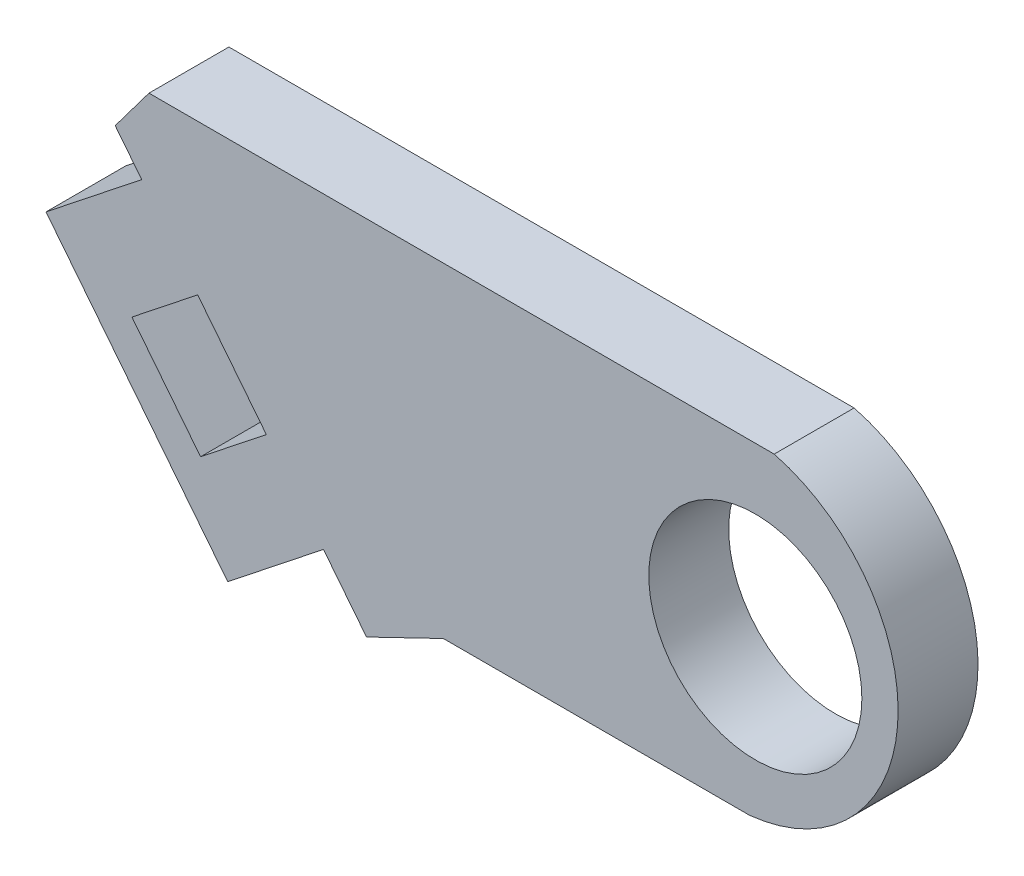
ISO-10303-21;
HEADER;
FILE_DESCRIPTION(('STEP AP214'),'2;1');
FILE_NAME('part.step','',(''),(''),'','','');
FILE_SCHEMA(('AUTOMOTIVE_DESIGN { 1 0 10303 214 1 1 1 1 }'));
ENDSEC;
DATA;
#1=APPLICATION_CONTEXT('core data for automotive mechanical design processes');
#2=APPLICATION_PROTOCOL_DEFINITION('international standard','automotive_design',2000,#1);
#3=PRODUCT_CONTEXT('',#1,'mechanical');
#4=PRODUCT('Part','Part','',(#3));
#5=PRODUCT_RELATED_PRODUCT_CATEGORY('part','',(#4));
#6=PRODUCT_DEFINITION_FORMATION('','',#4);
#7=PRODUCT_DEFINITION_CONTEXT('part definition',#1,'design');
#8=PRODUCT_DEFINITION('design','',#6,#7);
#9=PRODUCT_DEFINITION_SHAPE('','',#8);
#10=(LENGTH_UNIT() NAMED_UNIT(*) SI_UNIT(.MILLI.,.METRE.));
#11=(NAMED_UNIT(*) PLANE_ANGLE_UNIT() SI_UNIT($,.RADIAN.));
#12=(NAMED_UNIT(*) SI_UNIT($,.STERADIAN.) SOLID_ANGLE_UNIT());
#13=UNCERTAINTY_MEASURE_WITH_UNIT(LENGTH_MEASURE(1.E-05),#10,'distance_accuracy_value','');
#14=(GEOMETRIC_REPRESENTATION_CONTEXT(3) GLOBAL_UNCERTAINTY_ASSIGNED_CONTEXT((#13)) GLOBAL_UNIT_ASSIGNED_CONTEXT((#10,
#11,#12)) REPRESENTATION_CONTEXT('',''));
#15=CARTESIAN_POINT('',(0.,0.,0.));
#16=DIRECTION('',(0.,0.,1.));
#17=DIRECTION('',(1.,0.,0.));
#18=AXIS2_PLACEMENT_3D('',#15,#16,#17);
#19=CARTESIAN_POINT('',(3.41129841970065,-4.30599411770939,-3.));
#20=DIRECTION('',(0.62096994988635,-0.78383437111302,0.));
#21=DIRECTION('',(0.78383437111302,0.62096994988635,0.));
#22=AXIS2_PLACEMENT_3D('',#19,#20,#21);
#23=PLANE('',#22);
#24=DIRECTION('',(0.78383437111302,0.62096994988635,0.));
#25=VECTOR('',#24,1.);
#26=CARTESIAN_POINT('',(3.41129841970065,-4.30599411770939,0.));
#27=LINE('',#26,#25);
#28=CARTESIAN_POINT('',(3.41129841970065,-4.30599411770939,0.));
#29=VERTEX_POINT('',#28);
#30=CARTESIAN_POINT('',(7.00517901125505,-1.45884689747952,0.));
#31=VERTEX_POINT('',#30);
#32=EDGE_CURVE('E170',#29,#31,#27,.T.);
#33=ORIENTED_EDGE('',*,*,#32,.F.);
#34=DIRECTION('',(0.,0.,1.));
#35=VECTOR('',#34,1.);
#36=CARTESIAN_POINT('',(3.41129841970065,-4.30599411770939,-3.));
#37=LINE('',#36,#35);
#38=CARTESIAN_POINT('',(3.41129841970065,-4.30599411770939,-3.));
#39=VERTEX_POINT('',#38);
#40=EDGE_CURVE('E11',#39,#29,#37,.T.);
#41=ORIENTED_EDGE('',*,*,#40,.F.);
#42=DIRECTION('',(0.78383437111302,0.62096994988635,0.));
#43=VECTOR('',#42,1.);
#44=CARTESIAN_POINT('',(3.41129841970065,-4.30599411770939,-3.));
#45=LINE('',#44,#43);
#46=CARTESIAN_POINT('',(7.00517901125505,-1.45884689747952,-3.));
#47=VERTEX_POINT('',#46);
#48=EDGE_CURVE('E174',#39,#47,#45,.T.);
#49=ORIENTED_EDGE('',*,*,#48,.T.);
#50=DIRECTION('',(0.,0.,1.));
#51=VECTOR('',#50,1.);
#52=CARTESIAN_POINT('',(7.00517901125505,-1.45884689747952,-3.));
#53=LINE('',#52,#51);
#54=EDGE_CURVE('E35',#47,#31,#53,.T.);
#55=ORIENTED_EDGE('',*,*,#54,.T.);
#56=EDGE_LOOP('',(#33,#41,#49,#55));
#57=FACE_BOUND('',#56,.T.);
#58=ADVANCED_FACE('F32',(#57),#23,.T.);
#59=CARTESIAN_POINT('',(-3.41129841970065,4.30599411770939,-3.));
#60=DIRECTION('',(-0.783834371113022,-0.620969949886348,0.));
#61=DIRECTION('',(0.620969949886348,-0.783834371113022,0.));
#62=AXIS2_PLACEMENT_3D('',#59,#60,#61);
#63=PLANE('',#62);
#64=DIRECTION('',(0.620969949886347,-0.783834371113022,0.));
#65=VECTOR('',#64,1.);
#66=CARTESIAN_POINT('',(-3.41129841970065,4.30599411770939,0.));
#67=LINE('',#66,#65);
#68=CARTESIAN_POINT('',(-3.41129841970065,4.30599411770939,0.));
#69=VERTEX_POINT('',#68);
#70=EDGE_CURVE('E178',#69,#29,#67,.T.);
#71=ORIENTED_EDGE('',*,*,#70,.F.);
#72=DIRECTION('',(0.,0.,1.));
#73=VECTOR('',#72,1.);
#74=CARTESIAN_POINT('',(-3.41129841970065,4.30599411770939,-3.));
#75=LINE('',#74,#73);
#76=CARTESIAN_POINT('',(-3.41129841970065,4.30599411770939,-3.));
#77=VERTEX_POINT('',#76);
#78=EDGE_CURVE('E40',#77,#69,#75,.T.);
#79=ORIENTED_EDGE('',*,*,#78,.F.);
#80=DIRECTION('',(0.620969949886347,-0.783834371113022,0.));
#81=VECTOR('',#80,1.);
#82=CARTESIAN_POINT('',(-3.41129841970065,4.30599411770939,-3.));
#83=LINE('',#82,#81);
#84=EDGE_CURVE('E202',#77,#39,#83,.T.);
#85=ORIENTED_EDGE('',*,*,#84,.T.);
#86=ORIENTED_EDGE('',*,*,#40,.T.);
#87=EDGE_LOOP('',(#71,#79,#85,#86));
#88=FACE_BOUND('',#87,.T.);
#89=ADVANCED_FACE('F259',(#88),#63,.T.);
#90=CARTESIAN_POINT('',(-3.41129841970065,4.30599411770939,-3.));
#91=DIRECTION('',(-0.620969949886348,0.783834371113022,0.));
#92=DIRECTION('',(-0.783834371113022,-0.620969949886348,0.));
#93=AXIS2_PLACEMENT_3D('',#90,#91,#92);
#94=PLANE('',#93);
#95=DIRECTION('',(-0.783834371113022,-0.620969949886348,0.));
#96=VECTOR('',#95,1.);
#97=CARTESIAN_POINT('',(-3.41129841970065,4.30599411770939,0.));
#98=LINE('',#97,#96);
#99=CARTESIAN_POINT('',(0.182582171852518,7.15314133793826,0.));
#100=VERTEX_POINT('',#99);
#101=EDGE_CURVE('E228',#100,#69,#98,.T.);
#102=ORIENTED_EDGE('',*,*,#101,.F.);
#103=DIRECTION('',(0.,0.,1.));
#104=VECTOR('',#103,1.);
#105=CARTESIAN_POINT('',(0.182582171852518,7.15314133793826,-3.));
#106=LINE('',#105,#104);
#107=CARTESIAN_POINT('',(0.182582171852518,7.15314133793826,-3.));
#108=VERTEX_POINT('',#107);
#109=EDGE_CURVE('E234',#108,#100,#106,.T.);
#110=ORIENTED_EDGE('',*,*,#109,.F.);
#111=DIRECTION('',(-0.783834371113022,-0.620969949886348,0.));
#112=VECTOR('',#111,1.);
#113=CARTESIAN_POINT('',(-3.41129841970065,4.30599411770939,-3.));
#114=LINE('',#113,#112);
#115=EDGE_CURVE('E199',#108,#77,#114,.T.);
#116=ORIENTED_EDGE('',*,*,#115,.T.);
#117=ORIENTED_EDGE('',*,*,#78,.T.);
#118=EDGE_LOOP('',(#102,#110,#116,#117));
#119=FACE_BOUND('',#118,.T.);
#120=ADVANCED_FACE('F286',(#119),#94,.T.);
#121=CARTESIAN_POINT('',(-0.813143142790196,8.41001975201794,-3.));
#122=DIRECTION('',(-0.783834371113024,-0.620969949886345,0.));
#123=DIRECTION('',(0.620969949886345,-0.783834371113024,0.));
#124=AXIS2_PLACEMENT_3D('',#121,#122,#123);
#125=PLANE('',#124);
#126=DIRECTION('',(0.620969949886345,-0.783834371113024,0.));
#127=VECTOR('',#126,1.);
#128=CARTESIAN_POINT('',(-0.813143142790196,8.41001975201794,0.));
#129=LINE('',#128,#127);
#130=CARTESIAN_POINT('',(-0.813143142790196,8.41001975201794,0.));
#131=VERTEX_POINT('',#130);
#132=EDGE_CURVE('E225',#131,#100,#129,.T.);
#133=ORIENTED_EDGE('',*,*,#132,.F.);
#134=DIRECTION('',(0.,0.,1.));
#135=VECTOR('',#134,1.);
#136=CARTESIAN_POINT('',(-0.813143142790196,8.41001975201794,-3.));
#137=LINE('',#136,#135);
#138=CARTESIAN_POINT('',(-0.813143142790196,8.41001975201794,-3.));
#139=VERTEX_POINT('',#138);
#140=EDGE_CURVE('E236',#139,#131,#137,.T.);
#141=ORIENTED_EDGE('',*,*,#140,.F.);
#142=DIRECTION('',(0.620969949886345,-0.783834371113024,0.));
#143=VECTOR('',#142,1.);
#144=CARTESIAN_POINT('',(-0.813143142790196,8.41001975201794,-3.));
#145=LINE('',#144,#143);
#146=EDGE_CURVE('E196',#139,#108,#145,.T.);
#147=ORIENTED_EDGE('',*,*,#146,.T.);
#148=ORIENTED_EDGE('',*,*,#109,.T.);
#149=EDGE_LOOP('',(#133,#141,#147,#148));
#150=FACE_BOUND('',#149,.T.);
#151=ADVANCED_FACE('F284',(#150),#125,.T.);
#152=CARTESIAN_POINT('',(-0.813143142790196,8.41001975201794,-3.));
#153=DIRECTION('',(-0.799998928148521,0.600001429132646,0.));
#154=DIRECTION('',(-0.600001429132646,-0.799998928148521,0.));
#155=AXIS2_PLACEMENT_3D('',#152,#153,#154);
#156=PLANE('',#155);
#157=DIRECTION('',(-0.600001429132646,-0.799998928148521,0.));
#158=VECTOR('',#157,1.);
#159=CARTESIAN_POINT('',(-0.813143142790196,8.41001975201794,0.));
#160=LINE('',#159,#158);
#161=CARTESIAN_POINT('',(0.454659876967119,10.1004174871958,0.));
#162=VERTEX_POINT('',#161);
#163=EDGE_CURVE('E222',#162,#131,#160,.T.);
#164=ORIENTED_EDGE('',*,*,#163,.F.);
#165=DIRECTION('',(0.,0.,1.));
#166=VECTOR('',#165,1.);
#167=CARTESIAN_POINT('',(0.454659876967119,10.1004174871958,-3.));
#168=LINE('',#167,#166);
#169=CARTESIAN_POINT('',(0.454659876967119,10.1004174871958,-3.));
#170=VERTEX_POINT('',#169);
#171=EDGE_CURVE('E238',#170,#162,#168,.T.);
#172=ORIENTED_EDGE('',*,*,#171,.F.);
#173=DIRECTION('',(-0.600001429132646,-0.799998928148521,0.));
#174=VECTOR('',#173,1.);
#175=CARTESIAN_POINT('',(-0.813143142790196,8.41001975201794,-3.));
#176=LINE('',#175,#174);
#177=EDGE_CURVE('E193',#170,#139,#176,.T.);
#178=ORIENTED_EDGE('',*,*,#177,.T.);
#179=ORIENTED_EDGE('',*,*,#140,.T.);
#180=EDGE_LOOP('',(#164,#172,#178,#179));
#181=FACE_BOUND('',#180,.T.);
#182=ADVANCED_FACE('F280',(#181),#156,.T.);
#183=CARTESIAN_POINT('',(0.454659876967119,10.1004174871958,-3.));
#184=DIRECTION('',(0.,1.,0.));
#185=DIRECTION('',(-1.,0.,0.));
#186=AXIS2_PLACEMENT_3D('',#183,#184,#185);
#187=PLANE('',#186);
#188=DIRECTION('',(-1.,0.,0.));
#189=VECTOR('',#188,1.);
#190=CARTESIAN_POINT('',(0.454659876967119,10.1004174871958,0.));
#191=LINE('',#190,#189);
#192=CARTESIAN_POINT('',(23.9256598769671,10.1004174871962,0.));
#193=VERTEX_POINT('',#192);
#194=EDGE_CURVE('E219',#193,#162,#191,.T.);
#195=ORIENTED_EDGE('',*,*,#194,.F.);
#196=DIRECTION('',(0.,0.,1.));
#197=VECTOR('',#196,1.);
#198=CARTESIAN_POINT('',(23.9256598769671,10.1004174871962,-3.));
#199=LINE('',#198,#197);
#200=CARTESIAN_POINT('',(23.9256598769671,10.1004174871962,-3.));
#201=VERTEX_POINT('',#200);
#202=EDGE_CURVE('E240',#201,#193,#199,.T.);
#203=ORIENTED_EDGE('',*,*,#202,.F.);
#204=DIRECTION('',(-1.,0.,0.));
#205=VECTOR('',#204,1.);
#206=CARTESIAN_POINT('',(0.454659876967119,10.1004174871958,-3.));
#207=LINE('',#206,#205);
#208=EDGE_CURVE('E190',#201,#170,#207,.T.);
#209=ORIENTED_EDGE('',*,*,#208,.T.);
#210=ORIENTED_EDGE('',*,*,#171,.T.);
#211=EDGE_LOOP('',(#195,#203,#209,#210));
#212=FACE_BOUND('',#211,.T.);
#213=ADVANCED_FACE('F276',(#212),#187,.T.);
#214=CARTESIAN_POINT('',(22.3574656584487,4.08135054181249,-3.));
#215=DIRECTION('',(0.,0.,1.));
#216=DIRECTION('',(1.,0.,0.));
#217=AXIS2_PLACEMENT_3D('',#214,#215,#216);
#218=CYLINDRICAL_SURFACE('',#217,6.22000000000003);
#219=CARTESIAN_POINT('',(22.3574656584487,4.08135054181249,0.));
#220=DIRECTION('',(0.,0.,1.));
#221=DIRECTION('',(1.,0.,0.));
#222=AXIS2_PLACEMENT_3D('',#219,#220,#221);
#223=CIRCLE('',#222,6.22000000000003);
#224=CARTESIAN_POINT('',(23.0003635073065,-2.1053353525848,0.));
#225=VERTEX_POINT('',#224);
#226=EDGE_CURVE('E216',#225,#193,#223,.T.);
#227=ORIENTED_EDGE('',*,*,#226,.F.);
#228=DIRECTION('',(0.,0.,1.));
#229=VECTOR('',#228,1.);
#230=CARTESIAN_POINT('',(23.0003635073065,-2.1053353525848,-3.));
#231=LINE('',#230,#229);
#232=CARTESIAN_POINT('',(23.0003635073065,-2.1053353525848,-3.));
#233=VERTEX_POINT('',#232);
#234=EDGE_CURVE('E242',#233,#225,#231,.T.);
#235=ORIENTED_EDGE('',*,*,#234,.F.);
#236=CARTESIAN_POINT('',(22.3574656584487,4.08135054181249,-3.));
#237=DIRECTION('',(0.,0.,1.));
#238=DIRECTION('',(1.,0.,0.));
#239=AXIS2_PLACEMENT_3D('',#236,#237,#238);
#240=CIRCLE('',#239,6.22000000000003);
#241=EDGE_CURVE('E187',#233,#201,#240,.T.);
#242=ORIENTED_EDGE('',*,*,#241,.T.);
#243=ORIENTED_EDGE('',*,*,#202,.T.);
#244=EDGE_LOOP('',(#227,#235,#242,#243));
#245=FACE_BOUND('',#244,.T.);
#246=ADVANCED_FACE('F272',(#245),#218,.T.);
#247=CARTESIAN_POINT('',(11.5053635090573,-2.10553597818655,-3.));
#248=DIRECTION('',(1.74532929224492E-05,-0.999999999847691,0.));
#249=DIRECTION('',(0.999999999847691,1.74532929224492E-05,0.));
#250=AXIS2_PLACEMENT_3D('',#247,#248,#249);
#251=PLANE('',#250);
#252=DIRECTION('',(0.999999999847691,1.74532929224492E-05,0.));
#253=VECTOR('',#252,1.);
#254=CARTESIAN_POINT('',(11.5053635090573,-2.10553597818655,0.));
#255=LINE('',#254,#253);
#256=CARTESIAN_POINT('',(11.5053635090573,-2.10553597818655,0.));
#257=VERTEX_POINT('',#256);
#258=EDGE_CURVE('E213',#257,#225,#255,.T.);
#259=ORIENTED_EDGE('',*,*,#258,.F.);
#260=DIRECTION('',(0.,0.,1.));
#261=VECTOR('',#260,1.);
#262=CARTESIAN_POINT('',(11.5053635090573,-2.10553597818655,-3.));
#263=LINE('',#262,#261);
#264=CARTESIAN_POINT('',(11.5053635090573,-2.10553597818655,-3.));
#265=VERTEX_POINT('',#264);
#266=EDGE_CURVE('E244',#265,#257,#263,.T.);
#267=ORIENTED_EDGE('',*,*,#266,.F.);
#268=DIRECTION('',(0.999999999847691,1.74532929224492E-05,0.));
#269=VECTOR('',#268,1.);
#270=CARTESIAN_POINT('',(11.5053635090573,-2.10553597818655,-3.));
#271=LINE('',#270,#269);
#272=EDGE_CURVE('E184',#265,#233,#271,.T.);
#273=ORIENTED_EDGE('',*,*,#272,.T.);
#274=ORIENTED_EDGE('',*,*,#234,.T.);
#275=EDGE_LOOP('',(#259,#267,#273,#274));
#276=FACE_BOUND('',#275,.T.);
#277=ADVANCED_FACE('F270',(#276),#251,.T.);
#278=CARTESIAN_POINT('',(8.62125330583921,-3.49877584830702,-3.));
#279=DIRECTION('',(0.434979665975796,-0.90044027574714,0.));
#280=DIRECTION('',(0.90044027574714,0.434979665975796,0.));
#281=AXIS2_PLACEMENT_3D('',#278,#279,#280);
#282=PLANE('',#281);
#283=DIRECTION('',(0.90044027574714,0.434979665975796,0.));
#284=VECTOR('',#283,1.);
#285=CARTESIAN_POINT('',(8.62125330583921,-3.49877584830702,0.));
#286=LINE('',#285,#284);
#287=CARTESIAN_POINT('',(8.62125330583921,-3.49877584830702,0.));
#288=VERTEX_POINT('',#287);
#289=EDGE_CURVE('E210',#288,#257,#286,.T.);
#290=ORIENTED_EDGE('',*,*,#289,.F.);
#291=DIRECTION('',(0.,0.,1.));
#292=VECTOR('',#291,1.);
#293=CARTESIAN_POINT('',(8.62125330583921,-3.49877584830702,-3.));
#294=LINE('',#293,#292);
#295=CARTESIAN_POINT('',(8.62125330583921,-3.49877584830702,-3.));
#296=VERTEX_POINT('',#295);
#297=EDGE_CURVE('E245',#296,#288,#294,.T.);
#298=ORIENTED_EDGE('',*,*,#297,.F.);
#299=DIRECTION('',(0.90044027574714,0.434979665975796,0.));
#300=VECTOR('',#299,1.);
#301=CARTESIAN_POINT('',(8.62125330583921,-3.49877584830702,-3.));
#302=LINE('',#301,#300);
#303=EDGE_CURVE('E181',#296,#265,#302,.T.);
#304=ORIENTED_EDGE('',*,*,#303,.T.);
#305=ORIENTED_EDGE('',*,*,#266,.T.);
#306=EDGE_LOOP('',(#290,#298,#304,#305));
#307=FACE_BOUND('',#306,.T.);
#308=ADVANCED_FACE('F266',(#307),#282,.T.);
#309=CARTESIAN_POINT('',(8.62125330583921,-3.49877584830702,-3.));
#310=DIRECTION('',(-0.783834371112966,-0.620969949886419,0.));
#311=DIRECTION('',(0.620969949886419,-0.783834371112966,0.));
#312=AXIS2_PLACEMENT_3D('',#309,#310,#311);
#313=PLANE('',#312);
#314=DIRECTION('',(0.620969949886418,-0.783834371112966,0.));
#315=VECTOR('',#314,1.);
#316=CARTESIAN_POINT('',(8.62125330583921,-3.49877584830702,0.));
#317=LINE('',#316,#315);
#318=EDGE_CURVE('E207',#31,#288,#317,.T.);
#319=ORIENTED_EDGE('',*,*,#318,.F.);
#320=ORIENTED_EDGE('',*,*,#54,.F.);
#321=DIRECTION('',(0.620969949886418,-0.783834371112966,0.));
#322=VECTOR('',#321,1.);
#323=CARTESIAN_POINT('',(8.62125330583921,-3.49877584830702,-3.));
#324=LINE('',#323,#322);
#325=EDGE_CURVE('E177',#47,#296,#324,.T.);
#326=ORIENTED_EDGE('',*,*,#325,.T.);
#327=ORIENTED_EDGE('',*,*,#297,.T.);
#328=EDGE_LOOP('',(#319,#320,#326,#327));
#329=FACE_BOUND('',#328,.T.);
#330=ADVANCED_FACE('F253',(#329),#313,.T.);
#331=CARTESIAN_POINT('',(22.3574656584487,4.08135054181249,-3.));
#332=DIRECTION('',(0.,0.,1.));
#333=DIRECTION('',(1.,0.,0.));
#334=AXIS2_PLACEMENT_3D('',#331,#332,#333);
#335=PLANE('',#334);
#336=CARTESIAN_POINT('',(23.2173635073057,3.80266464741551,-3.));
#337=DIRECTION('',(0.,0.,1.));
#338=DIRECTION('',(1.,0.,0.));
#339=AXIS2_PLACEMENT_3D('',#336,#337,#338);
#340=CIRCLE('',#339,3.9999999999952);
#341=CARTESIAN_POINT('',(27.2173635073009,3.80266464741551,-3.));
#342=VERTEX_POINT('',#341);
#343=EDGE_CURVE('E164',#342,#342,#340,.T.);
#344=ORIENTED_EDGE('',*,*,#343,.T.);
#345=EDGE_LOOP('',(#344));
#346=FACE_BOUND('',#345,.T.);
#347=DIRECTION('',(-0.62096994988635,0.78383437111302,0.));
#348=VECTOR('',#347,1.);
#349=CARTESIAN_POINT('',(2.28334050718906,4.45615294384562,-3.));
#350=LINE('',#349,#348);
#351=CARTESIAN_POINT('',(4.86036579921741,1.20324030372658,-3.));
#352=VERTEX_POINT('',#351);
#353=CARTESIAN_POINT('',(2.28334050718906,4.45615294384562,-3.));
#354=VERTEX_POINT('',#353);
#355=EDGE_CURVE('E141',#352,#354,#350,.T.);
#356=ORIENTED_EDGE('',*,*,#355,.T.);
#357=DIRECTION('',(-0.78383437111302,-0.620969949886351,0.));
#358=VECTOR('',#357,1.);
#359=CARTESIAN_POINT('',(2.28334050718906,4.45615294384562,-3.));
#360=LINE('',#359,#358);
#361=CARTESIAN_POINT('',(-0.185737761816955,2.50009760170361,-3.));
#362=VERTEX_POINT('',#361);
#363=EDGE_CURVE('E135',#354,#362,#360,.T.);
#364=ORIENTED_EDGE('',*,*,#363,.T.);
#365=DIRECTION('',(0.620969949886351,-0.78383437111302,0.));
#366=VECTOR('',#365,1.);
#367=CARTESIAN_POINT('',(-0.185737761816955,2.50009760170361,-3.));
#368=LINE('',#367,#366);
#369=CARTESIAN_POINT('',(2.3912875302114,-0.752815038415421,-3.));
#370=VERTEX_POINT('',#369);
#371=EDGE_CURVE('E144',#362,#370,#368,.T.);
#372=ORIENTED_EDGE('',*,*,#371,.T.);
#373=DIRECTION('',(0.78383437111302,0.62096994988635,0.));
#374=VECTOR('',#373,1.);
#375=CARTESIAN_POINT('',(4.86036579921741,1.20324030372658,-3.));
#376=LINE('',#375,#374);
#377=EDGE_CURVE('E48',#370,#352,#376,.T.);
#378=ORIENTED_EDGE('',*,*,#377,.T.);
#379=EDGE_LOOP('',(#356,#364,#372,#378));
#380=FACE_BOUND('',#379,.T.);
#381=ORIENTED_EDGE('',*,*,#48,.F.);
#382=ORIENTED_EDGE('',*,*,#84,.F.);
#383=ORIENTED_EDGE('',*,*,#115,.F.);
#384=ORIENTED_EDGE('',*,*,#146,.F.);
#385=ORIENTED_EDGE('',*,*,#177,.F.);
#386=ORIENTED_EDGE('',*,*,#208,.F.);
#387=ORIENTED_EDGE('',*,*,#241,.F.);
#388=ORIENTED_EDGE('',*,*,#272,.F.);
#389=ORIENTED_EDGE('',*,*,#303,.F.);
#390=ORIENTED_EDGE('',*,*,#325,.F.);
#391=EDGE_LOOP('',(#381,#382,#383,#384,#385,#386,#387,#388,#389,#390));
#392=FACE_BOUND('',#391,.T.);
#393=ADVANCED_FACE('F148',(#346,#380,#392),#335,.F.);
#394=CARTESIAN_POINT('',(22.3574656584487,4.08135054181249,0.));
#395=DIRECTION('',(0.,0.,1.));
#396=DIRECTION('',(1.,0.,0.));
#397=AXIS2_PLACEMENT_3D('',#394,#395,#396);
#398=PLANE('',#397);
#399=CARTESIAN_POINT('',(23.2173635073057,3.80266464741551,0.));
#400=DIRECTION('',(0.,0.,1.));
#401=DIRECTION('',(1.,0.,0.));
#402=AXIS2_PLACEMENT_3D('',#399,#400,#401);
#403=CIRCLE('',#402,3.9999999999952);
#404=CARTESIAN_POINT('',(27.2173635073009,3.80266464741551,0.));
#405=VERTEX_POINT('',#404);
#406=EDGE_CURVE('E157',#405,#405,#403,.T.);
#407=ORIENTED_EDGE('',*,*,#406,.F.);
#408=EDGE_LOOP('',(#407));
#409=FACE_BOUND('',#408,.T.);
#410=DIRECTION('',(-0.78383437111302,-0.620969949886351,0.));
#411=VECTOR('',#410,1.);
#412=CARTESIAN_POINT('',(2.28334050718906,4.45615294384562,0.));
#413=LINE('',#412,#411);
#414=CARTESIAN_POINT('',(2.28334050718906,4.45615294384562,0.));
#415=VERTEX_POINT('',#414);
#416=CARTESIAN_POINT('',(-0.185737761816957,2.50009760170361,0.));
#417=VERTEX_POINT('',#416);
#418=EDGE_CURVE('E56',#415,#417,#413,.T.);
#419=ORIENTED_EDGE('',*,*,#418,.F.);
#420=DIRECTION('',(-0.62096994988635,0.78383437111302,0.));
#421=VECTOR('',#420,1.);
#422=CARTESIAN_POINT('',(2.28334050718906,4.45615294384562,0.));
#423=LINE('',#422,#421);
#424=CARTESIAN_POINT('',(4.86036579921741,1.20324030372658,0.));
#425=VERTEX_POINT('',#424);
#426=EDGE_CURVE('E151',#425,#415,#423,.T.);
#427=ORIENTED_EDGE('',*,*,#426,.F.);
#428=DIRECTION('',(0.78383437111302,0.62096994988635,0.));
#429=VECTOR('',#428,1.);
#430=CARTESIAN_POINT('',(4.86036579921741,1.20324030372658,0.));
#431=LINE('',#430,#429);
#432=CARTESIAN_POINT('',(2.3912875302114,-0.75281503841542,0.));
#433=VERTEX_POINT('',#432);
#434=EDGE_CURVE('E154',#433,#425,#431,.T.);
#435=ORIENTED_EDGE('',*,*,#434,.F.);
#436=DIRECTION('',(0.620969949886351,-0.78383437111302,0.));
#437=VECTOR('',#436,1.);
#438=CARTESIAN_POINT('',(-0.185737761816955,2.50009760170361,0.));
#439=LINE('',#438,#437);
#440=EDGE_CURVE('E163',#417,#433,#439,.T.);
#441=ORIENTED_EDGE('',*,*,#440,.F.);
#442=EDGE_LOOP('',(#419,#427,#435,#441));
#443=FACE_BOUND('',#442,.T.);
#444=ORIENTED_EDGE('',*,*,#32,.T.);
#445=ORIENTED_EDGE('',*,*,#318,.T.);
#446=ORIENTED_EDGE('',*,*,#289,.T.);
#447=ORIENTED_EDGE('',*,*,#258,.T.);
#448=ORIENTED_EDGE('',*,*,#226,.T.);
#449=ORIENTED_EDGE('',*,*,#194,.T.);
#450=ORIENTED_EDGE('',*,*,#163,.T.);
#451=ORIENTED_EDGE('',*,*,#132,.T.);
#452=ORIENTED_EDGE('',*,*,#101,.T.);
#453=ORIENTED_EDGE('',*,*,#70,.T.);
#454=EDGE_LOOP('',(#444,#445,#446,#447,#448,#449,#450,#451,#452,#453));
#455=FACE_BOUND('',#454,.T.);
#456=ADVANCED_FACE('F255',(#409,#443,#455),#398,.T.);
#457=CARTESIAN_POINT('',(2.28334050718906,4.45615294384562,-3.));
#458=DIRECTION('',(-0.620969949886351,0.78383437111302,0.));
#459=DIRECTION('',(-0.78383437111302,-0.620969949886351,0.));
#460=AXIS2_PLACEMENT_3D('',#457,#458,#459);
#461=PLANE('',#460);
#462=ORIENTED_EDGE('',*,*,#418,.T.);
#463=DIRECTION('',(0.,0.,1.));
#464=VECTOR('',#463,1.);
#465=CARTESIAN_POINT('',(-0.185737761816955,2.50009760170361,-3.));
#466=LINE('',#465,#464);
#467=EDGE_CURVE('E131',#362,#417,#466,.T.);
#468=ORIENTED_EDGE('',*,*,#467,.F.);
#469=ORIENTED_EDGE('',*,*,#363,.F.);
#470=DIRECTION('',(0.,0.,1.));
#471=VECTOR('',#470,1.);
#472=CARTESIAN_POINT('',(2.28334050718906,4.45615294384562,-3.));
#473=LINE('',#472,#471);
#474=EDGE_CURVE('E168',#354,#415,#473,.T.);
#475=ORIENTED_EDGE('',*,*,#474,.T.);
#476=EDGE_LOOP('',(#462,#468,#469,#475));
#477=FACE_BOUND('',#476,.T.);
#478=ADVANCED_FACE('F133',(#477),#461,.F.);
#479=CARTESIAN_POINT('',(2.28334050718906,4.45615294384562,-3.));
#480=DIRECTION('',(0.78383437111302,0.620969949886351,0.));
#481=DIRECTION('',(-0.620969949886351,0.78383437111302,0.));
#482=AXIS2_PLACEMENT_3D('',#479,#480,#481);
#483=PLANE('',#482);
#484=ORIENTED_EDGE('',*,*,#426,.T.);
#485=ORIENTED_EDGE('',*,*,#474,.F.);
#486=ORIENTED_EDGE('',*,*,#355,.F.);
#487=DIRECTION('',(0.,0.,1.));
#488=VECTOR('',#487,1.);
#489=CARTESIAN_POINT('',(4.86036579921741,1.20324030372658,-3.));
#490=LINE('',#489,#488);
#491=EDGE_CURVE('E171',#352,#425,#490,.T.);
#492=ORIENTED_EDGE('',*,*,#491,.T.);
#493=EDGE_LOOP('',(#484,#485,#486,#492));
#494=FACE_BOUND('',#493,.T.);
#495=ADVANCED_FACE('F386',(#494),#483,.F.);
#496=CARTESIAN_POINT('',(4.86036579921741,1.20324030372658,-3.));
#497=DIRECTION('',(0.62096994988635,-0.78383437111302,0.));
#498=DIRECTION('',(0.78383437111302,0.62096994988635,0.));
#499=AXIS2_PLACEMENT_3D('',#496,#497,#498);
#500=PLANE('',#499);
#501=ORIENTED_EDGE('',*,*,#434,.T.);
#502=ORIENTED_EDGE('',*,*,#491,.F.);
#503=ORIENTED_EDGE('',*,*,#377,.F.);
#504=DIRECTION('',(0.,0.,1.));
#505=VECTOR('',#504,1.);
#506=CARTESIAN_POINT('',(2.3912875302114,-0.75281503841542,-3.));
#507=LINE('',#506,#505);
#508=EDGE_CURVE('E140',#370,#433,#507,.T.);
#509=ORIENTED_EDGE('',*,*,#508,.T.);
#510=EDGE_LOOP('',(#501,#502,#503,#509));
#511=FACE_BOUND('',#510,.T.);
#512=ADVANCED_FACE('F395',(#511),#500,.F.);
#513=CARTESIAN_POINT('',(-0.185737761816955,2.50009760170361,-3.));
#514=DIRECTION('',(-0.78383437111302,-0.620969949886351,0.));
#515=DIRECTION('',(0.620969949886351,-0.78383437111302,0.));
#516=AXIS2_PLACEMENT_3D('',#513,#514,#515);
#517=PLANE('',#516);
#518=ORIENTED_EDGE('',*,*,#440,.T.);
#519=ORIENTED_EDGE('',*,*,#508,.F.);
#520=ORIENTED_EDGE('',*,*,#371,.F.);
#521=ORIENTED_EDGE('',*,*,#467,.T.);
#522=EDGE_LOOP('',(#518,#519,#520,#521));
#523=FACE_BOUND('',#522,.T.);
#524=ADVANCED_FACE('F145',(#523),#517,.F.);
#525=CARTESIAN_POINT('',(23.2173635073057,3.80266464741551,-3.));
#526=DIRECTION('',(0.,0.,1.));
#527=DIRECTION('',(1.,0.,0.));
#528=AXIS2_PLACEMENT_3D('',#525,#526,#527);
#529=CYLINDRICAL_SURFACE('',#528,3.9999999999952);
#530=ORIENTED_EDGE('',*,*,#343,.F.);
#531=EDGE_LOOP('',(#530));
#532=FACE_BOUND('',#531,.T.);
#533=ORIENTED_EDGE('',*,*,#406,.T.);
#534=EDGE_LOOP('',(#533));
#535=FACE_BOUND('',#534,.T.);
#536=ADVANCED_FACE('F413',(#532,#535),#529,.F.);
#537=CLOSED_SHELL('',(#58,#89,#120,#151,#182,#213,#246,#277,#308,#330,#393,#456,#478,#495,#512,
#524,#536));
#538=MANIFOLD_SOLID_BREP('B2',#537);
#539=ADVANCED_BREP_SHAPE_REPRESENTATION('',(#18,#538),#14);
#540=SHAPE_DEFINITION_REPRESENTATION(#9,#539);
ENDSEC;
END-ISO-10303-21;
